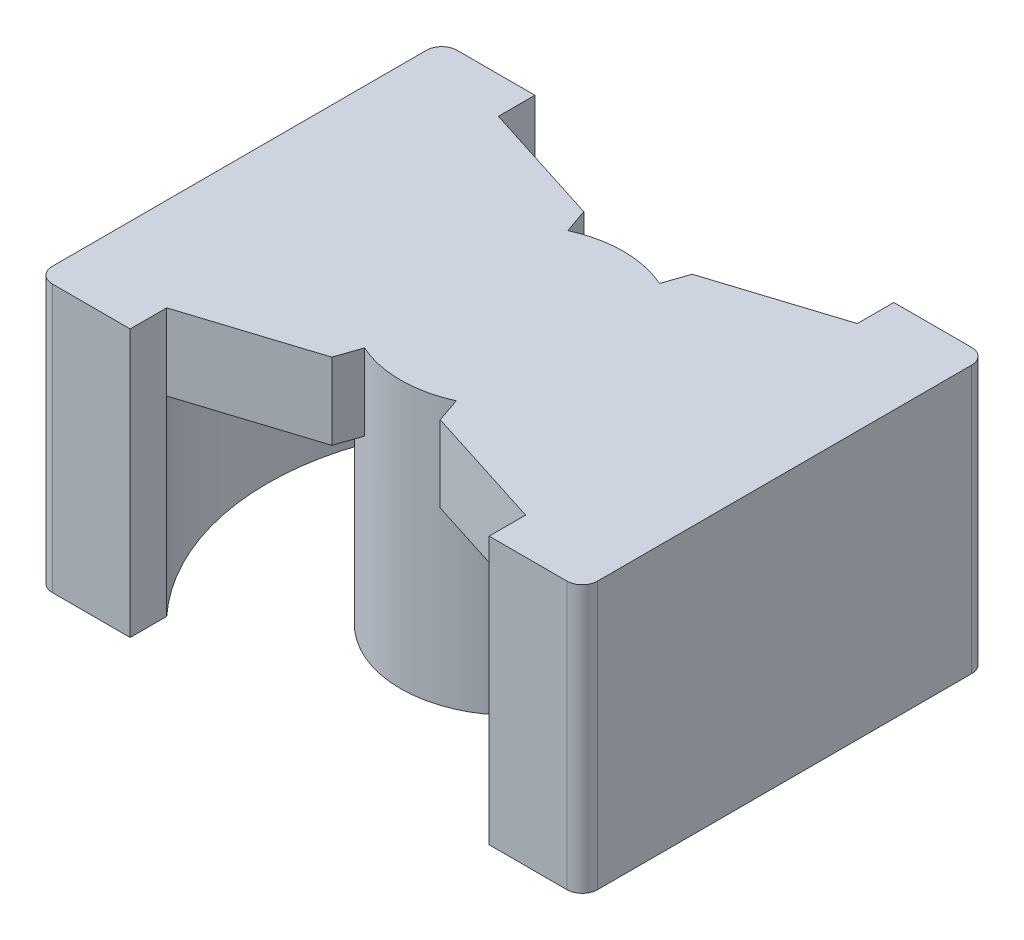
ISO-10303-21;
HEADER;
FILE_DESCRIPTION(('STEP AP214'),'2;1');
FILE_NAME('part.step','',(''),(''),'','','');
FILE_SCHEMA(('AUTOMOTIVE_DESIGN { 1 0 10303 214 1 1 1 1 }'));
ENDSEC;
DATA;
#1=APPLICATION_CONTEXT('core data for automotive mechanical design processes');
#2=APPLICATION_PROTOCOL_DEFINITION('international standard','automotive_design',2000,#1);
#3=PRODUCT_CONTEXT('',#1,'mechanical');
#4=PRODUCT('Part','Part','',(#3));
#5=PRODUCT_RELATED_PRODUCT_CATEGORY('part','',(#4));
#6=PRODUCT_DEFINITION_FORMATION('','',#4);
#7=PRODUCT_DEFINITION_CONTEXT('part definition',#1,'design');
#8=PRODUCT_DEFINITION('design','',#6,#7);
#9=PRODUCT_DEFINITION_SHAPE('','',#8);
#10=(LENGTH_UNIT() NAMED_UNIT(*) SI_UNIT(.MILLI.,.METRE.));
#11=(NAMED_UNIT(*) PLANE_ANGLE_UNIT() SI_UNIT($,.RADIAN.));
#12=(NAMED_UNIT(*) SI_UNIT($,.STERADIAN.) SOLID_ANGLE_UNIT());
#13=UNCERTAINTY_MEASURE_WITH_UNIT(LENGTH_MEASURE(1.E-05),#10,'distance_accuracy_value','');
#14=(GEOMETRIC_REPRESENTATION_CONTEXT(3) GLOBAL_UNCERTAINTY_ASSIGNED_CONTEXT((#13)) GLOBAL_UNIT_ASSIGNED_CONTEXT((#10,
#11,#12)) REPRESENTATION_CONTEXT('',''));
#15=CARTESIAN_POINT('',(0.,0.,0.));
#16=DIRECTION('',(0.,0.,1.));
#17=DIRECTION('',(1.,0.,0.));
#18=AXIS2_PLACEMENT_3D('',#15,#16,#17);
#19=CARTESIAN_POINT('',(16.85,17.5,12.25));
#20=DIRECTION('',(0.,-1.,0.));
#21=DIRECTION('',(0.,0.,-1.));
#22=AXIS2_PLACEMENT_3D('',#19,#20,#21);
#23=CYLINDRICAL_SURFACE('',#22,1.);
#24=CARTESIAN_POINT('',(16.85,0.,12.25));
#25=DIRECTION('',(0.,-1.,0.));
#26=DIRECTION('',(0.,0.,-1.));
#27=AXIS2_PLACEMENT_3D('',#24,#25,#26);
#28=CIRCLE('',#27,1.);
#29=CARTESIAN_POINT('',(17.85,0.,12.25));
#30=VERTEX_POINT('',#29);
#31=CARTESIAN_POINT('',(16.85,0.,13.25));
#32=VERTEX_POINT('',#31);
#33=EDGE_CURVE('E466',#30,#32,#28,.T.);
#34=ORIENTED_EDGE('',*,*,#33,.F.);
#35=DIRECTION('',(0.,1.,0.));
#36=VECTOR('',#35,1.);
#37=CARTESIAN_POINT('',(17.85,17.5,12.25));
#38=LINE('',#37,#36);
#39=CARTESIAN_POINT('',(17.85,17.5,12.25));
#40=VERTEX_POINT('',#39);
#41=EDGE_CURVE('E192',#30,#40,#38,.T.);
#42=ORIENTED_EDGE('',*,*,#41,.T.);
#43=CARTESIAN_POINT('',(16.85,17.5,12.25));
#44=DIRECTION('',(0.,-1.,0.));
#45=DIRECTION('',(0.,0.,-1.));
#46=AXIS2_PLACEMENT_3D('',#43,#44,#45);
#47=CIRCLE('',#46,1.);
#48=CARTESIAN_POINT('',(16.85,17.5,13.25));
#49=VERTEX_POINT('',#48);
#50=EDGE_CURVE('E20',#40,#49,#47,.T.);
#51=ORIENTED_EDGE('',*,*,#50,.T.);
#52=DIRECTION('',(0.,1.,0.));
#53=VECTOR('',#52,1.);
#54=CARTESIAN_POINT('',(16.85,17.5,13.25));
#55=LINE('',#54,#53);
#56=EDGE_CURVE('E190',#49,#32,#55,.F.);
#57=ORIENTED_EDGE('',*,*,#56,.T.);
#58=EDGE_LOOP('',(#34,#42,#51,#57));
#59=FACE_BOUND('',#58,.T.);
#60=ADVANCED_FACE('F17',(#59),#23,.T.);
#61=CARTESIAN_POINT('',(-16.85,17.5,12.25));
#62=DIRECTION('',(0.,-1.,0.));
#63=DIRECTION('',(0.,0.,-1.));
#64=AXIS2_PLACEMENT_3D('',#61,#62,#63);
#65=CYLINDRICAL_SURFACE('',#64,1.);
#66=CARTESIAN_POINT('',(-16.85,0.,12.25));
#67=DIRECTION('',(0.,-1.,0.));
#68=DIRECTION('',(0.,0.,-1.));
#69=AXIS2_PLACEMENT_3D('',#66,#67,#68);
#70=CIRCLE('',#69,1.);
#71=CARTESIAN_POINT('',(-16.85,0.,13.25));
#72=VERTEX_POINT('',#71);
#73=CARTESIAN_POINT('',(-17.85,0.,12.25));
#74=VERTEX_POINT('',#73);
#75=EDGE_CURVE('E475',#72,#74,#70,.T.);
#76=ORIENTED_EDGE('',*,*,#75,.F.);
#77=DIRECTION('',(0.,1.,0.));
#78=VECTOR('',#77,1.);
#79=CARTESIAN_POINT('',(-16.85,17.5,13.25));
#80=LINE('',#79,#78);
#81=CARTESIAN_POINT('',(-16.85,17.5,13.25));
#82=VERTEX_POINT('',#81);
#83=EDGE_CURVE('E286',#72,#82,#80,.T.);
#84=ORIENTED_EDGE('',*,*,#83,.T.);
#85=CARTESIAN_POINT('',(-16.85,17.5,12.25));
#86=DIRECTION('',(0.,-1.,0.));
#87=DIRECTION('',(0.,0.,-1.));
#88=AXIS2_PLACEMENT_3D('',#85,#86,#87);
#89=CIRCLE('',#88,1.);
#90=CARTESIAN_POINT('',(-17.85,17.5,12.25));
#91=VERTEX_POINT('',#90);
#92=EDGE_CURVE('E194',#82,#91,#89,.T.);
#93=ORIENTED_EDGE('',*,*,#92,.T.);
#94=DIRECTION('',(0.,1.,0.));
#95=VECTOR('',#94,1.);
#96=CARTESIAN_POINT('',(-17.85,17.5,12.25));
#97=LINE('',#96,#95);
#98=EDGE_CURVE('E279',#91,#74,#97,.F.);
#99=ORIENTED_EDGE('',*,*,#98,.T.);
#100=EDGE_LOOP('',(#76,#84,#93,#99));
#101=FACE_BOUND('',#100,.T.);
#102=ADVANCED_FACE('F482',(#101),#65,.T.);
#103=CARTESIAN_POINT('',(-16.85,17.5,-12.25));
#104=DIRECTION('',(0.,-1.,0.));
#105=DIRECTION('',(0.,0.,-1.));
#106=AXIS2_PLACEMENT_3D('',#103,#104,#105);
#107=CYLINDRICAL_SURFACE('',#106,1.);
#108=CARTESIAN_POINT('',(-16.85,0.,-12.25));
#109=DIRECTION('',(0.,-1.,0.));
#110=DIRECTION('',(0.,0.,-1.));
#111=AXIS2_PLACEMENT_3D('',#108,#109,#110);
#112=CIRCLE('',#111,1.);
#113=CARTESIAN_POINT('',(-17.85,0.,-12.25));
#114=VERTEX_POINT('',#113);
#115=CARTESIAN_POINT('',(-16.85,0.,-13.25));
#116=VERTEX_POINT('',#115);
#117=EDGE_CURVE('E387',#114,#116,#112,.T.);
#118=ORIENTED_EDGE('',*,*,#117,.F.);
#119=DIRECTION('',(0.,1.,0.));
#120=VECTOR('',#119,1.);
#121=CARTESIAN_POINT('',(-17.85,17.5,-12.25));
#122=LINE('',#121,#120);
#123=CARTESIAN_POINT('',(-17.85,17.5,-12.25));
#124=VERTEX_POINT('',#123);
#125=EDGE_CURVE('E282',#114,#124,#122,.T.);
#126=ORIENTED_EDGE('',*,*,#125,.T.);
#127=CARTESIAN_POINT('',(-16.85,17.5,-12.25));
#128=DIRECTION('',(0.,-1.,0.));
#129=DIRECTION('',(0.,0.,-1.));
#130=AXIS2_PLACEMENT_3D('',#127,#128,#129);
#131=CIRCLE('',#130,1.);
#132=CARTESIAN_POINT('',(-16.85,17.5,-13.25));
#133=VERTEX_POINT('',#132);
#134=EDGE_CURVE('E479',#124,#133,#131,.T.);
#135=ORIENTED_EDGE('',*,*,#134,.T.);
#136=DIRECTION('',(0.,1.,0.));
#137=VECTOR('',#136,1.);
#138=CARTESIAN_POINT('',(-16.85,17.5,-13.25));
#139=LINE('',#138,#137);
#140=EDGE_CURVE('E260',#133,#116,#139,.F.);
#141=ORIENTED_EDGE('',*,*,#140,.T.);
#142=EDGE_LOOP('',(#118,#126,#135,#141));
#143=FACE_BOUND('',#142,.T.);
#144=ADVANCED_FACE('F628',(#143),#107,.T.);
#145=CARTESIAN_POINT('',(0.,12.5,0.));
#146=DIRECTION('',(0.,-1.,0.));
#147=DIRECTION('',(0.,0.,-1.));
#148=AXIS2_PLACEMENT_3D('',#145,#146,#147);
#149=CYLINDRICAL_SURFACE('',#148,16.);
#150=CARTESIAN_POINT('',(0.,12.5,0.));
#151=DIRECTION('',(0.,-1.,0.));
#152=DIRECTION('',(0.,0.,-1.));
#153=AXIS2_PLACEMENT_3D('',#150,#151,#152);
#154=CIRCLE('',#153,16.);
#155=CARTESIAN_POINT('',(-11.75,12.5,-10.8599033144867));
#156=VERTEX_POINT('',#155);
#157=CARTESIAN_POINT('',(-11.75,12.5,10.8599033144867));
#158=VERTEX_POINT('',#157);
#159=EDGE_CURVE('E377',#156,#158,#154,.F.);
#160=ORIENTED_EDGE('',*,*,#159,.T.);
#161=DIRECTION('',(0.,1.,0.));
#162=VECTOR('',#161,1.);
#163=CARTESIAN_POINT('',(-11.75,17.5,10.8599033144867));
#164=LINE('',#163,#162);
#165=CARTESIAN_POINT('',(-11.75,0.,10.8599033144867));
#166=VERTEX_POINT('',#165);
#167=EDGE_CURVE('E303',#166,#158,#164,.T.);
#168=ORIENTED_EDGE('',*,*,#167,.F.);
#169=CARTESIAN_POINT('',(0.,0.,0.));
#170=DIRECTION('',(0.,-1.,0.));
#171=DIRECTION('',(0.,0.,-1.));
#172=AXIS2_PLACEMENT_3D('',#169,#170,#171);
#173=CIRCLE('',#172,16.);
#174=CARTESIAN_POINT('',(-11.75,0.,-10.8599033144867));
#175=VERTEX_POINT('',#174);
#176=EDGE_CURVE('E477',#175,#166,#173,.F.);
#177=ORIENTED_EDGE('',*,*,#176,.F.);
#178=DIRECTION('',(0.,1.,0.));
#179=VECTOR('',#178,1.);
#180=CARTESIAN_POINT('',(-11.75,17.5,-10.8599033144867));
#181=LINE('',#180,#179);
#182=EDGE_CURVE('E276',#175,#156,#181,.T.);
#183=ORIENTED_EDGE('',*,*,#182,.T.);
#184=EDGE_LOOP('',(#160,#168,#177,#183));
#185=FACE_BOUND('',#184,.T.);
#186=ADVANCED_FACE('F624',(#185),#149,.F.);
#187=CARTESIAN_POINT('',(17.85,0.,-13.25));
#188=DIRECTION('',(0.,-1.,0.));
#189=DIRECTION('',(0.,0.,-1.));
#190=AXIS2_PLACEMENT_3D('',#187,#188,#189);
#191=PLANE('',#190);
#192=ORIENTED_EDGE('',*,*,#117,.T.);
#193=DIRECTION('',(1.,0.,0.));
#194=VECTOR('',#193,1.);
#195=CARTESIAN_POINT('',(-17.85,0.,-13.25));
#196=LINE('',#195,#194);
#197=CARTESIAN_POINT('',(-11.75,0.,-13.25));
#198=VERTEX_POINT('',#197);
#199=EDGE_CURVE('E263',#116,#198,#196,.T.);
#200=ORIENTED_EDGE('',*,*,#199,.T.);
#201=DIRECTION('',(0.,0.,1.));
#202=VECTOR('',#201,1.);
#203=CARTESIAN_POINT('',(-11.75,0.,-13.25));
#204=LINE('',#203,#202);
#205=EDGE_CURVE('E275',#198,#175,#204,.T.);
#206=ORIENTED_EDGE('',*,*,#205,.T.);
#207=ORIENTED_EDGE('',*,*,#176,.T.);
#208=DIRECTION('',(0.,0.,-1.));
#209=VECTOR('',#208,1.);
#210=CARTESIAN_POINT('',(-11.75,0.,13.25));
#211=LINE('',#210,#209);
#212=CARTESIAN_POINT('',(-11.75,0.,13.25));
#213=VERTEX_POINT('',#212);
#214=EDGE_CURVE('E314',#213,#166,#211,.T.);
#215=ORIENTED_EDGE('',*,*,#214,.F.);
#216=DIRECTION('',(-1.,0.,0.));
#217=VECTOR('',#216,1.);
#218=CARTESIAN_POINT('',(-17.85,0.,13.25));
#219=LINE('',#218,#217);
#220=EDGE_CURVE('E289',#213,#72,#219,.T.);
#221=ORIENTED_EDGE('',*,*,#220,.T.);
#222=ORIENTED_EDGE('',*,*,#75,.T.);
#223=DIRECTION('',(0.,0.,-1.));
#224=VECTOR('',#223,1.);
#225=CARTESIAN_POINT('',(-17.85,0.,13.25));
#226=LINE('',#225,#224);
#227=EDGE_CURVE('E264',#74,#114,#226,.T.);
#228=ORIENTED_EDGE('',*,*,#227,.T.);
#229=EDGE_LOOP('',(#192,#200,#206,#207,#215,#221,#222,#228));
#230=FACE_BOUND('',#229,.T.);
#231=ADVANCED_FACE('F621',(#230),#191,.T.);
#232=CARTESIAN_POINT('',(-3.55,17.5,8.25));
#233=DIRECTION('',(0.945368367347967,0.,0.326004064419203));
#234=DIRECTION('',(0.326004064419203,0.,-0.945368367347967));
#235=AXIS2_PLACEMENT_3D('',#232,#233,#234);
#236=PLANE('',#235);
#237=DIRECTION('',(0.326004064419203,0.,-0.945368367347967));
#238=VECTOR('',#237,1.);
#239=CARTESIAN_POINT('',(-3.55,17.5,8.25));
#240=LINE('',#239,#238);
#241=CARTESIAN_POINT('',(-3.,17.5,6.65507325278993));
#242=VERTEX_POINT('',#241);
#243=CARTESIAN_POINT('',(-3.55,17.5,8.25));
#244=VERTEX_POINT('',#243);
#245=EDGE_CURVE('E383',#242,#244,#240,.F.);
#246=ORIENTED_EDGE('',*,*,#245,.T.);
#247=DIRECTION('',(0.,1.,0.));
#248=VECTOR('',#247,1.);
#249=CARTESIAN_POINT('',(-3.55,17.5,8.25));
#250=LINE('',#249,#248);
#251=CARTESIAN_POINT('',(-3.55,12.5,8.25));
#252=VERTEX_POINT('',#251);
#253=EDGE_CURVE('E311',#252,#244,#250,.T.);
#254=ORIENTED_EDGE('',*,*,#253,.F.);
#255=DIRECTION('',(0.326004064419203,0.,-0.945368367347967));
#256=VECTOR('',#255,1.);
#257=CARTESIAN_POINT('',(-3.55,12.5,8.25));
#258=LINE('',#257,#256);
#259=CARTESIAN_POINT('',(-3.,12.5,6.65507325278993));
#260=VERTEX_POINT('',#259);
#261=EDGE_CURVE('E380',#252,#260,#258,.T.);
#262=ORIENTED_EDGE('',*,*,#261,.T.);
#263=DIRECTION('',(0.,-1.,0.));
#264=VECTOR('',#263,1.);
#265=CARTESIAN_POINT('',(-3.,12.5,6.65507325278993));
#266=LINE('',#265,#264);
#267=EDGE_CURVE('E318',#242,#260,#266,.T.);
#268=ORIENTED_EDGE('',*,*,#267,.F.);
#269=EDGE_LOOP('',(#246,#254,#262,#268));
#270=FACE_BOUND('',#269,.T.);
#271=ADVANCED_FACE('F516',(#270),#236,.T.);
#272=CARTESIAN_POINT('',(0.,12.5,0.));
#273=DIRECTION('',(0.,1.,0.));
#274=DIRECTION('',(0.,0.,1.));
#275=AXIS2_PLACEMENT_3D('',#272,#273,#274);
#276=PLANE('',#275);
#277=DIRECTION('',(0.95289849900019,0.,0.303289384257321));
#278=VECTOR('',#277,1.);
#279=CARTESIAN_POINT('',(-11.75,12.5,-10.8599033144867));
#280=LINE('',#279,#278);
#281=CARTESIAN_POINT('',(-3.55,12.5,-8.25));
#282=VERTEX_POINT('',#281);
#283=EDGE_CURVE('E392',#156,#282,#280,.T.);
#284=ORIENTED_EDGE('',*,*,#283,.T.);
#285=DIRECTION('',(0.326004064419203,0.,0.945368367347967));
#286=VECTOR('',#285,1.);
#287=CARTESIAN_POINT('',(-3.55,12.5,-8.25));
#288=LINE('',#287,#286);
#289=CARTESIAN_POINT('',(-3.,12.5,-6.65507325278993));
#290=VERTEX_POINT('',#289);
#291=EDGE_CURVE('E372',#282,#290,#288,.T.);
#292=ORIENTED_EDGE('',*,*,#291,.T.);
#293=CARTESIAN_POINT('',(0.,12.5,0.));
#294=DIRECTION('',(0.,-1.,0.));
#295=DIRECTION('',(0.,0.,-1.));
#296=AXIS2_PLACEMENT_3D('',#293,#294,#295);
#297=CIRCLE('',#296,7.3);
#298=EDGE_CURVE('E259',#260,#290,#297,.T.);
#299=ORIENTED_EDGE('',*,*,#298,.F.);
#300=ORIENTED_EDGE('',*,*,#261,.F.);
#301=DIRECTION('',(0.95289849900019,0.,-0.303289384257321));
#302=VECTOR('',#301,1.);
#303=CARTESIAN_POINT('',(-11.75,12.5,10.8599033144867));
#304=LINE('',#303,#302);
#305=EDGE_CURVE('E315',#158,#252,#304,.T.);
#306=ORIENTED_EDGE('',*,*,#305,.F.);
#307=ORIENTED_EDGE('',*,*,#159,.F.);
#308=EDGE_LOOP('',(#284,#292,#299,#300,#306,#307));
#309=FACE_BOUND('',#308,.T.);
#310=ADVANCED_FACE('F614',(#309),#276,.F.);
#311=CARTESIAN_POINT('',(-3.55,17.5,-8.25));
#312=DIRECTION('',(-0.945368367347967,0.,0.326004064419203));
#313=DIRECTION('',(0.326004064419203,0.,0.945368367347967));
#314=AXIS2_PLACEMENT_3D('',#311,#312,#313);
#315=PLANE('',#314);
#316=DIRECTION('',(0.326004064419203,0.,0.945368367347967));
#317=VECTOR('',#316,1.);
#318=CARTESIAN_POINT('',(-3.55,17.5,-8.25));
#319=LINE('',#318,#317);
#320=CARTESIAN_POINT('',(-3.,17.5,-6.65507325278993));
#321=VERTEX_POINT('',#320);
#322=CARTESIAN_POINT('',(-3.55,17.5,-8.25));
#323=VERTEX_POINT('',#322);
#324=EDGE_CURVE('E368',#321,#323,#319,.F.);
#325=ORIENTED_EDGE('',*,*,#324,.F.);
#326=DIRECTION('',(0.,-1.,0.));
#327=VECTOR('',#326,1.);
#328=CARTESIAN_POINT('',(-3.,12.5,-6.65507325278993));
#329=LINE('',#328,#327);
#330=EDGE_CURVE('E256',#290,#321,#329,.F.);
#331=ORIENTED_EDGE('',*,*,#330,.F.);
#332=ORIENTED_EDGE('',*,*,#291,.F.);
#333=DIRECTION('',(0.,1.,0.));
#334=VECTOR('',#333,1.);
#335=CARTESIAN_POINT('',(-3.55,17.5,-8.25));
#336=LINE('',#335,#334);
#337=EDGE_CURVE('E395',#282,#323,#336,.T.);
#338=ORIENTED_EDGE('',*,*,#337,.T.);
#339=EDGE_LOOP('',(#325,#331,#332,#338));
#340=FACE_BOUND('',#339,.T.);
#341=ADVANCED_FACE('F610',(#340),#315,.F.);
#342=CARTESIAN_POINT('',(17.85,0.,-13.25));
#343=DIRECTION('',(0.,-1.,0.));
#344=DIRECTION('',(0.,0.,-1.));
#345=AXIS2_PLACEMENT_3D('',#342,#343,#344);
#346=PLANE('',#345);
#347=CARTESIAN_POINT('',(0.,0.,0.));
#348=DIRECTION('',(0.,-1.,0.));
#349=DIRECTION('',(0.,0.,-1.));
#350=AXIS2_PLACEMENT_3D('',#347,#348,#349);
#351=CIRCLE('',#350,7.3);
#352=CARTESIAN_POINT('',(0.,0.,-7.3));
#353=VERTEX_POINT('',#352);
#354=EDGE_CURVE('E255',#353,#353,#351,.F.);
#355=ORIENTED_EDGE('',*,*,#354,.F.);
#356=EDGE_LOOP('',(#355));
#357=FACE_BOUND('',#356,.T.);
#358=ADVANCED_FACE('F607',(#357),#346,.T.);
#359=CARTESIAN_POINT('',(3.55,17.5,8.25));
#360=DIRECTION('',(-0.945368367347967,0.,0.326004064419203));
#361=DIRECTION('',(0.326004064419203,0.,0.945368367347967));
#362=AXIS2_PLACEMENT_3D('',#359,#360,#361);
#363=PLANE('',#362);
#364=DIRECTION('',(0.326004064419203,0.,0.945368367347967));
#365=VECTOR('',#364,1.);
#366=CARTESIAN_POINT('',(3.55,17.5,8.25));
#367=LINE('',#366,#365);
#368=CARTESIAN_POINT('',(3.55,17.5,8.25));
#369=VERTEX_POINT('',#368);
#370=CARTESIAN_POINT('',(3.,17.5,6.65507325278993));
#371=VERTEX_POINT('',#370);
#372=EDGE_CURVE('E364',#369,#371,#367,.F.);
#373=ORIENTED_EDGE('',*,*,#372,.T.);
#374=DIRECTION('',(0.,-1.,0.));
#375=VECTOR('',#374,1.);
#376=CARTESIAN_POINT('',(3.,12.5,6.65507325278993));
#377=LINE('',#376,#375);
#378=CARTESIAN_POINT('',(3.,12.5,6.65507325278993));
#379=VERTEX_POINT('',#378);
#380=EDGE_CURVE('E321',#379,#371,#377,.F.);
#381=ORIENTED_EDGE('',*,*,#380,.F.);
#382=DIRECTION('',(0.326004064419204,0.,0.945368367347966));
#383=VECTOR('',#382,1.);
#384=CARTESIAN_POINT('',(3.,12.5,6.65507325278993));
#385=LINE('',#384,#383);
#386=CARTESIAN_POINT('',(3.55,12.5,8.25));
#387=VERTEX_POINT('',#386);
#388=EDGE_CURVE('E360',#379,#387,#385,.T.);
#389=ORIENTED_EDGE('',*,*,#388,.T.);
#390=DIRECTION('',(0.,1.,0.));
#391=VECTOR('',#390,1.);
#392=CARTESIAN_POINT('',(3.55,17.5,8.25));
#393=LINE('',#392,#391);
#394=EDGE_CURVE('E423',#369,#387,#393,.F.);
#395=ORIENTED_EDGE('',*,*,#394,.F.);
#396=EDGE_LOOP('',(#373,#381,#389,#395));
#397=FACE_BOUND('',#396,.T.);
#398=ADVANCED_FACE('F523',(#397),#363,.T.);
#399=CARTESIAN_POINT('',(0.,12.5,0.));
#400=DIRECTION('',(0.,1.,0.));
#401=DIRECTION('',(0.,0.,1.));
#402=AXIS2_PLACEMENT_3D('',#399,#400,#401);
#403=PLANE('',#402);
#404=DIRECTION('',(0.326004064419203,0.,-0.945368367347967));
#405=VECTOR('',#404,1.);
#406=CARTESIAN_POINT('',(3.55,12.5,-8.25));
#407=LINE('',#406,#405);
#408=CARTESIAN_POINT('',(3.,12.5,-6.65507325278993));
#409=VERTEX_POINT('',#408);
#410=CARTESIAN_POINT('',(3.55,12.5,-8.25));
#411=VERTEX_POINT('',#410);
#412=EDGE_CURVE('E355',#409,#411,#407,.T.);
#413=ORIENTED_EDGE('',*,*,#412,.T.);
#414=DIRECTION('',(0.95289849900019,0.,-0.303289384257321));
#415=VECTOR('',#414,1.);
#416=CARTESIAN_POINT('',(11.75,12.5,-10.8599033144867));
#417=LINE('',#416,#415);
#418=CARTESIAN_POINT('',(11.75,12.5,-10.8599033144867));
#419=VERTEX_POINT('',#418);
#420=EDGE_CURVE('E248',#411,#419,#417,.T.);
#421=ORIENTED_EDGE('',*,*,#420,.T.);
#422=CARTESIAN_POINT('',(0.,12.5,0.));
#423=DIRECTION('',(0.,-1.,0.));
#424=DIRECTION('',(0.,0.,-1.));
#425=AXIS2_PLACEMENT_3D('',#422,#423,#424);
#426=CIRCLE('',#425,16.);
#427=CARTESIAN_POINT('',(11.75,12.5,10.8599033144867));
#428=VERTEX_POINT('',#427);
#429=EDGE_CURVE('E354',#419,#428,#426,.T.);
#430=ORIENTED_EDGE('',*,*,#429,.T.);
#431=DIRECTION('',(0.95289849900019,0.,0.303289384257321));
#432=VECTOR('',#431,1.);
#433=CARTESIAN_POINT('',(11.75,12.5,10.8599033144867));
#434=LINE('',#433,#432);
#435=EDGE_CURVE('E430',#387,#428,#434,.T.);
#436=ORIENTED_EDGE('',*,*,#435,.F.);
#437=ORIENTED_EDGE('',*,*,#388,.F.);
#438=CARTESIAN_POINT('',(0.,12.5,0.));
#439=DIRECTION('',(0.,-1.,0.));
#440=DIRECTION('',(0.,0.,-1.));
#441=AXIS2_PLACEMENT_3D('',#438,#439,#440);
#442=CIRCLE('',#441,7.3);
#443=EDGE_CURVE('E254',#409,#379,#442,.T.);
#444=ORIENTED_EDGE('',*,*,#443,.F.);
#445=EDGE_LOOP('',(#413,#421,#430,#436,#437,#444));
#446=FACE_BOUND('',#445,.T.);
#447=ADVANCED_FACE('F600',(#446),#403,.F.);
#448=CARTESIAN_POINT('',(3.55,17.5,-8.25));
#449=DIRECTION('',(0.945368367347967,0.,0.326004064419203));
#450=DIRECTION('',(0.326004064419203,0.,-0.945368367347967));
#451=AXIS2_PLACEMENT_3D('',#448,#449,#450);
#452=PLANE('',#451);
#453=DIRECTION('',(0.326004064419203,0.,-0.945368367347967));
#454=VECTOR('',#453,1.);
#455=CARTESIAN_POINT('',(3.55,17.5,-8.25));
#456=LINE('',#455,#454);
#457=CARTESIAN_POINT('',(3.55,17.5,-8.25));
#458=VERTEX_POINT('',#457);
#459=CARTESIAN_POINT('',(3.,17.5,-6.65507325278993));
#460=VERTEX_POINT('',#459);
#461=EDGE_CURVE('E351',#458,#460,#456,.F.);
#462=ORIENTED_EDGE('',*,*,#461,.F.);
#463=DIRECTION('',(0.,1.,0.));
#464=VECTOR('',#463,1.);
#465=CARTESIAN_POINT('',(3.55,17.5,-8.25));
#466=LINE('',#465,#464);
#467=EDGE_CURVE('E238',#458,#411,#466,.F.);
#468=ORIENTED_EDGE('',*,*,#467,.T.);
#469=ORIENTED_EDGE('',*,*,#412,.F.);
#470=DIRECTION('',(0.,-1.,0.));
#471=VECTOR('',#470,1.);
#472=CARTESIAN_POINT('',(3.,12.5,-6.65507325278993));
#473=LINE('',#472,#471);
#474=EDGE_CURVE('E251',#460,#409,#473,.T.);
#475=ORIENTED_EDGE('',*,*,#474,.F.);
#476=EDGE_LOOP('',(#462,#468,#469,#475));
#477=FACE_BOUND('',#476,.T.);
#478=ADVANCED_FACE('F596',(#477),#452,.F.);
#479=CARTESIAN_POINT('',(0.,12.5,0.));
#480=DIRECTION('',(0.,-1.,0.));
#481=DIRECTION('',(0.,0.,-1.));
#482=AXIS2_PLACEMENT_3D('',#479,#480,#481);
#483=CYLINDRICAL_SURFACE('',#482,16.);
#484=CARTESIAN_POINT('',(0.,0.,0.));
#485=DIRECTION('',(0.,-1.,0.));
#486=DIRECTION('',(0.,0.,-1.));
#487=AXIS2_PLACEMENT_3D('',#484,#485,#486);
#488=CIRCLE('',#487,16.);
#489=CARTESIAN_POINT('',(11.75,0.,10.8599033144867));
#490=VERTEX_POINT('',#489);
#491=CARTESIAN_POINT('',(11.75,0.,-10.8599033144867));
#492=VERTEX_POINT('',#491);
#493=EDGE_CURVE('E336',#490,#492,#488,.F.);
#494=ORIENTED_EDGE('',*,*,#493,.F.);
#495=DIRECTION('',(0.,1.,0.));
#496=VECTOR('',#495,1.);
#497=CARTESIAN_POINT('',(11.75,17.5,10.8599033144867));
#498=LINE('',#497,#496);
#499=EDGE_CURVE('E328',#428,#490,#498,.F.);
#500=ORIENTED_EDGE('',*,*,#499,.F.);
#501=ORIENTED_EDGE('',*,*,#429,.F.);
#502=DIRECTION('',(0.,1.,0.));
#503=VECTOR('',#502,1.);
#504=CARTESIAN_POINT('',(11.75,17.5,-10.8599033144867));
#505=LINE('',#504,#503);
#506=EDGE_CURVE('E237',#419,#492,#505,.F.);
#507=ORIENTED_EDGE('',*,*,#506,.T.);
#508=EDGE_LOOP('',(#494,#500,#501,#507));
#509=FACE_BOUND('',#508,.T.);
#510=ADVANCED_FACE('F593',(#509),#483,.F.);
#511=CARTESIAN_POINT('',(16.85,17.5,-12.25));
#512=DIRECTION('',(0.,-1.,0.));
#513=DIRECTION('',(0.,0.,-1.));
#514=AXIS2_PLACEMENT_3D('',#511,#512,#513);
#515=CYLINDRICAL_SURFACE('',#514,1.);
#516=CARTESIAN_POINT('',(16.85,0.,-12.25));
#517=DIRECTION('',(0.,-1.,0.));
#518=DIRECTION('',(0.,0.,-1.));
#519=AXIS2_PLACEMENT_3D('',#516,#517,#518);
#520=CIRCLE('',#519,1.);
#521=CARTESIAN_POINT('',(16.85,0.,-13.25));
#522=VERTEX_POINT('',#521);
#523=CARTESIAN_POINT('',(17.85,0.,-12.25));
#524=VERTEX_POINT('',#523);
#525=EDGE_CURVE('E468',#522,#524,#520,.T.);
#526=ORIENTED_EDGE('',*,*,#525,.F.);
#527=DIRECTION('',(0.,1.,0.));
#528=VECTOR('',#527,1.);
#529=CARTESIAN_POINT('',(16.85,17.5,-13.25));
#530=LINE('',#529,#528);
#531=CARTESIAN_POINT('',(16.85,17.5,-13.25));
#532=VERTEX_POINT('',#531);
#533=EDGE_CURVE('E222',#522,#532,#530,.T.);
#534=ORIENTED_EDGE('',*,*,#533,.T.);
#535=CARTESIAN_POINT('',(16.85,17.5,-12.25));
#536=DIRECTION('',(0.,-1.,0.));
#537=DIRECTION('',(0.,0.,-1.));
#538=AXIS2_PLACEMENT_3D('',#535,#536,#537);
#539=CIRCLE('',#538,1.);
#540=CARTESIAN_POINT('',(17.85,17.5,-12.25));
#541=VERTEX_POINT('',#540);
#542=EDGE_CURVE('E470',#532,#541,#539,.T.);
#543=ORIENTED_EDGE('',*,*,#542,.T.);
#544=DIRECTION('',(0.,1.,0.));
#545=VECTOR('',#544,1.);
#546=CARTESIAN_POINT('',(17.85,17.5,-12.25));
#547=LINE('',#546,#545);
#548=EDGE_CURVE('E332',#541,#524,#547,.F.);
#549=ORIENTED_EDGE('',*,*,#548,.T.);
#550=EDGE_LOOP('',(#526,#534,#543,#549));
#551=FACE_BOUND('',#550,.T.);
#552=ADVANCED_FACE('F539',(#551),#515,.T.);
#553=CARTESIAN_POINT('',(17.85,0.,-13.25));
#554=DIRECTION('',(0.,-1.,0.));
#555=DIRECTION('',(0.,0.,-1.));
#556=AXIS2_PLACEMENT_3D('',#553,#554,#555);
#557=PLANE('',#556);
#558=DIRECTION('',(0.,0.,1.));
#559=VECTOR('',#558,1.);
#560=CARTESIAN_POINT('',(11.75,0.,13.25));
#561=LINE('',#560,#559);
#562=CARTESIAN_POINT('',(11.75,0.,13.25));
#563=VERTEX_POINT('',#562);
#564=EDGE_CURVE('E329',#490,#563,#561,.T.);
#565=ORIENTED_EDGE('',*,*,#564,.F.);
#566=ORIENTED_EDGE('',*,*,#493,.T.);
#567=DIRECTION('',(0.,0.,-1.));
#568=VECTOR('',#567,1.);
#569=CARTESIAN_POINT('',(11.75,0.,-13.25));
#570=LINE('',#569,#568);
#571=CARTESIAN_POINT('',(11.75,0.,-13.25));
#572=VERTEX_POINT('',#571);
#573=EDGE_CURVE('E225',#492,#572,#570,.T.);
#574=ORIENTED_EDGE('',*,*,#573,.T.);
#575=DIRECTION('',(1.,0.,0.));
#576=VECTOR('',#575,1.);
#577=CARTESIAN_POINT('',(-17.85,0.,-13.25));
#578=LINE('',#577,#576);
#579=EDGE_CURVE('E214',#572,#522,#578,.T.);
#580=ORIENTED_EDGE('',*,*,#579,.T.);
#581=ORIENTED_EDGE('',*,*,#525,.T.);
#582=DIRECTION('',(0.,0.,1.));
#583=VECTOR('',#582,1.);
#584=CARTESIAN_POINT('',(17.85,0.,13.25));
#585=LINE('',#584,#583);
#586=EDGE_CURVE('E335',#524,#30,#585,.T.);
#587=ORIENTED_EDGE('',*,*,#586,.T.);
#588=ORIENTED_EDGE('',*,*,#33,.T.);
#589=DIRECTION('',(-1.,0.,0.));
#590=VECTOR('',#589,1.);
#591=CARTESIAN_POINT('',(-17.85,0.,13.25));
#592=LINE('',#591,#590);
#593=EDGE_CURVE('E202',#32,#563,#592,.T.);
#594=ORIENTED_EDGE('',*,*,#593,.T.);
#595=EDGE_LOOP('',(#565,#566,#574,#580,#581,#587,#588,#594));
#596=FACE_BOUND('',#595,.T.);
#597=ADVANCED_FACE('F532',(#596),#557,.T.);
#598=CARTESIAN_POINT('',(17.85,17.5,13.25));
#599=DIRECTION('',(-1.,0.,0.));
#600=DIRECTION('',(0.,0.,1.));
#601=AXIS2_PLACEMENT_3D('',#598,#599,#600);
#602=PLANE('',#601);
#603=ORIENTED_EDGE('',*,*,#41,.F.);
#604=ORIENTED_EDGE('',*,*,#586,.F.);
#605=ORIENTED_EDGE('',*,*,#548,.F.);
#606=DIRECTION('',(0.,0.,-1.));
#607=VECTOR('',#606,1.);
#608=CARTESIAN_POINT('',(17.85,17.5,-13.25));
#609=LINE('',#608,#607);
#610=EDGE_CURVE('E210',#541,#40,#609,.F.);
#611=ORIENTED_EDGE('',*,*,#610,.T.);
#612=EDGE_LOOP('',(#603,#604,#605,#611));
#613=FACE_BOUND('',#612,.T.);
#614=ADVANCED_FACE('F535',(#613),#602,.F.);
#615=CARTESIAN_POINT('',(-17.85,17.5,13.25));
#616=DIRECTION('',(0.,0.,-1.));
#617=DIRECTION('',(-1.,0.,0.));
#618=AXIS2_PLACEMENT_3D('',#615,#616,#617);
#619=PLANE('',#618);
#620=ORIENTED_EDGE('',*,*,#593,.F.);
#621=ORIENTED_EDGE('',*,*,#56,.F.);
#622=DIRECTION('',(1.,0.,0.));
#623=VECTOR('',#622,1.);
#624=CARTESIAN_POINT('',(17.85,17.5,13.25));
#625=LINE('',#624,#623);
#626=CARTESIAN_POINT('',(11.75,17.5,13.25));
#627=VERTEX_POINT('',#626);
#628=EDGE_CURVE('E200',#49,#627,#625,.F.);
#629=ORIENTED_EDGE('',*,*,#628,.T.);
#630=DIRECTION('',(0.,1.,0.));
#631=VECTOR('',#630,1.);
#632=CARTESIAN_POINT('',(11.75,17.5,13.25));
#633=LINE('',#632,#631);
#634=EDGE_CURVE('E326',#563,#627,#633,.T.);
#635=ORIENTED_EDGE('',*,*,#634,.F.);
#636=EDGE_LOOP('',(#620,#621,#629,#635));
#637=FACE_BOUND('',#636,.T.);
#638=ADVANCED_FACE('F198',(#637),#619,.F.);
#639=CARTESIAN_POINT('',(11.75,17.5,13.25));
#640=DIRECTION('',(-1.,0.,0.));
#641=DIRECTION('',(0.,0.,1.));
#642=AXIS2_PLACEMENT_3D('',#639,#640,#641);
#643=PLANE('',#642);
#644=DIRECTION('',(0.,1.,0.));
#645=VECTOR('',#644,1.);
#646=CARTESIAN_POINT('',(11.75,17.5,10.8599033144867));
#647=LINE('',#646,#645);
#648=CARTESIAN_POINT('',(11.75,17.5,10.8599033144867));
#649=VERTEX_POINT('',#648);
#650=EDGE_CURVE('E433',#428,#649,#647,.T.);
#651=ORIENTED_EDGE('',*,*,#650,.F.);
#652=ORIENTED_EDGE('',*,*,#499,.T.);
#653=ORIENTED_EDGE('',*,*,#564,.T.);
#654=ORIENTED_EDGE('',*,*,#634,.T.);
#655=DIRECTION('',(0.,0.,-1.));
#656=VECTOR('',#655,1.);
#657=CARTESIAN_POINT('',(11.75,17.5,-13.25));
#658=LINE('',#657,#656);
#659=EDGE_CURVE('E209',#627,#649,#658,.T.);
#660=ORIENTED_EDGE('',*,*,#659,.T.);
#661=EDGE_LOOP('',(#651,#652,#653,#654,#660));
#662=FACE_BOUND('',#661,.T.);
#663=ADVANCED_FACE('F528',(#662),#643,.T.);
#664=CARTESIAN_POINT('',(11.75,17.5,10.8599033144867));
#665=DIRECTION('',(-0.303289384257321,0.,0.95289849900019));
#666=DIRECTION('',(0.95289849900019,0.,0.303289384257321));
#667=AXIS2_PLACEMENT_3D('',#664,#665,#666);
#668=PLANE('',#667);
#669=DIRECTION('',(-0.95289849900019,0.,-0.30328938425732));
#670=VECTOR('',#669,1.);
#671=CARTESIAN_POINT('',(11.75,17.5,10.8599033144867));
#672=LINE('',#671,#670);
#673=EDGE_CURVE('E212',#649,#369,#672,.T.);
#674=ORIENTED_EDGE('',*,*,#673,.T.);
#675=ORIENTED_EDGE('',*,*,#394,.T.);
#676=ORIENTED_EDGE('',*,*,#435,.T.);
#677=ORIENTED_EDGE('',*,*,#650,.T.);
#678=EDGE_LOOP('',(#674,#675,#676,#677));
#679=FACE_BOUND('',#678,.T.);
#680=ADVANCED_FACE('F580',(#679),#668,.T.);
#681=CARTESIAN_POINT('',(-11.75,17.5,10.8599033144867));
#682=DIRECTION('',(0.303289384257321,0.,0.95289849900019));
#683=DIRECTION('',(0.95289849900019,0.,-0.303289384257321));
#684=AXIS2_PLACEMENT_3D('',#681,#682,#683);
#685=PLANE('',#684);
#686=DIRECTION('',(-0.95289849900019,0.,0.303289384257321));
#687=VECTOR('',#686,1.);
#688=CARTESIAN_POINT('',(-3.55,17.5,8.25));
#689=LINE('',#688,#687);
#690=CARTESIAN_POINT('',(-11.75,17.5,10.8599033144867));
#691=VERTEX_POINT('',#690);
#692=EDGE_CURVE('E298',#244,#691,#689,.T.);
#693=ORIENTED_EDGE('',*,*,#692,.T.);
#694=DIRECTION('',(0.,1.,0.));
#695=VECTOR('',#694,1.);
#696=CARTESIAN_POINT('',(-11.75,17.5,10.8599033144867));
#697=LINE('',#696,#695);
#698=EDGE_CURVE('E301',#158,#691,#697,.T.);
#699=ORIENTED_EDGE('',*,*,#698,.F.);
#700=ORIENTED_EDGE('',*,*,#305,.T.);
#701=ORIENTED_EDGE('',*,*,#253,.T.);
#702=EDGE_LOOP('',(#693,#699,#700,#701));
#703=FACE_BOUND('',#702,.T.);
#704=ADVANCED_FACE('F510',(#703),#685,.T.);
#705=CARTESIAN_POINT('',(-11.75,17.5,13.25));
#706=DIRECTION('',(1.,0.,0.));
#707=DIRECTION('',(0.,0.,-1.));
#708=AXIS2_PLACEMENT_3D('',#705,#706,#707);
#709=PLANE('',#708);
#710=DIRECTION('',(0.,0.,-1.));
#711=VECTOR('',#710,1.);
#712=CARTESIAN_POINT('',(-11.75,17.5,-13.25));
#713=LINE('',#712,#711);
#714=CARTESIAN_POINT('',(-11.75,17.5,13.25));
#715=VERTEX_POINT('',#714);
#716=EDGE_CURVE('E294',#691,#715,#713,.F.);
#717=ORIENTED_EDGE('',*,*,#716,.T.);
#718=DIRECTION('',(0.,1.,0.));
#719=VECTOR('',#718,1.);
#720=CARTESIAN_POINT('',(-11.75,17.5,13.25));
#721=LINE('',#720,#719);
#722=EDGE_CURVE('E285',#715,#213,#721,.F.);
#723=ORIENTED_EDGE('',*,*,#722,.T.);
#724=ORIENTED_EDGE('',*,*,#214,.T.);
#725=ORIENTED_EDGE('',*,*,#167,.T.);
#726=ORIENTED_EDGE('',*,*,#698,.T.);
#727=EDGE_LOOP('',(#717,#723,#724,#725,#726));
#728=FACE_BOUND('',#727,.T.);
#729=ADVANCED_FACE('F505',(#728),#709,.T.);
#730=CARTESIAN_POINT('',(-17.85,17.5,13.25));
#731=DIRECTION('',(0.,0.,-1.));
#732=DIRECTION('',(-1.,0.,0.));
#733=AXIS2_PLACEMENT_3D('',#730,#731,#732);
#734=PLANE('',#733);
#735=DIRECTION('',(1.,0.,0.));
#736=VECTOR('',#735,1.);
#737=CARTESIAN_POINT('',(17.85,17.5,13.25));
#738=LINE('',#737,#736);
#739=EDGE_CURVE('E297',#715,#82,#738,.F.);
#740=ORIENTED_EDGE('',*,*,#739,.T.);
#741=ORIENTED_EDGE('',*,*,#83,.F.);
#742=ORIENTED_EDGE('',*,*,#220,.F.);
#743=ORIENTED_EDGE('',*,*,#722,.F.);
#744=EDGE_LOOP('',(#740,#741,#742,#743));
#745=FACE_BOUND('',#744,.T.);
#746=ADVANCED_FACE('F501',(#745),#734,.F.);
#747=CARTESIAN_POINT('',(-17.85,17.5,13.25));
#748=DIRECTION('',(1.,0.,0.));
#749=DIRECTION('',(0.,0.,-1.));
#750=AXIS2_PLACEMENT_3D('',#747,#748,#749);
#751=PLANE('',#750);
#752=ORIENTED_EDGE('',*,*,#98,.F.);
#753=DIRECTION('',(0.,0.,-1.));
#754=VECTOR('',#753,1.);
#755=CARTESIAN_POINT('',(-17.85,17.5,-13.25));
#756=LINE('',#755,#754);
#757=EDGE_CURVE('E491',#91,#124,#756,.T.);
#758=ORIENTED_EDGE('',*,*,#757,.T.);
#759=ORIENTED_EDGE('',*,*,#125,.F.);
#760=ORIENTED_EDGE('',*,*,#227,.F.);
#761=EDGE_LOOP('',(#752,#758,#759,#760));
#762=FACE_BOUND('',#761,.T.);
#763=ADVANCED_FACE('F490',(#762),#751,.F.);
#764=CARTESIAN_POINT('',(-17.85,17.5,-13.25));
#765=DIRECTION('',(0.,0.,1.));
#766=DIRECTION('',(1.,0.,0.));
#767=AXIS2_PLACEMENT_3D('',#764,#765,#766);
#768=PLANE('',#767);
#769=DIRECTION('',(0.,1.,0.));
#770=VECTOR('',#769,1.);
#771=CARTESIAN_POINT('',(-11.75,17.5,-13.25));
#772=LINE('',#771,#770);
#773=CARTESIAN_POINT('',(-11.75,17.5,-13.25));
#774=VERTEX_POINT('',#773);
#775=EDGE_CURVE('E272',#774,#198,#772,.F.);
#776=ORIENTED_EDGE('',*,*,#775,.T.);
#777=ORIENTED_EDGE('',*,*,#199,.F.);
#778=ORIENTED_EDGE('',*,*,#140,.F.);
#779=DIRECTION('',(1.,0.,0.));
#780=VECTOR('',#779,1.);
#781=CARTESIAN_POINT('',(17.85,17.5,-13.25));
#782=LINE('',#781,#780);
#783=EDGE_CURVE('E269',#133,#774,#782,.T.);
#784=ORIENTED_EDGE('',*,*,#783,.T.);
#785=EDGE_LOOP('',(#776,#777,#778,#784));
#786=FACE_BOUND('',#785,.T.);
#787=ADVANCED_FACE('F567',(#786),#768,.F.);
#788=CARTESIAN_POINT('',(-11.75,17.5,-13.25));
#789=DIRECTION('',(-1.,0.,0.));
#790=DIRECTION('',(0.,0.,1.));
#791=AXIS2_PLACEMENT_3D('',#788,#789,#790);
#792=PLANE('',#791);
#793=ORIENTED_EDGE('',*,*,#775,.F.);
#794=DIRECTION('',(0.,0.,-1.));
#795=VECTOR('',#794,1.);
#796=CARTESIAN_POINT('',(-11.75,17.5,-13.25));
#797=LINE('',#796,#795);
#798=CARTESIAN_POINT('',(-11.75,17.5,-10.8599033144867));
#799=VERTEX_POINT('',#798);
#800=EDGE_CURVE('E265',#774,#799,#797,.F.);
#801=ORIENTED_EDGE('',*,*,#800,.T.);
#802=DIRECTION('',(0.,1.,0.));
#803=VECTOR('',#802,1.);
#804=CARTESIAN_POINT('',(-11.75,17.5,-10.8599033144867));
#805=LINE('',#804,#803);
#806=EDGE_CURVE('E320',#799,#156,#805,.F.);
#807=ORIENTED_EDGE('',*,*,#806,.T.);
#808=ORIENTED_EDGE('',*,*,#182,.F.);
#809=ORIENTED_EDGE('',*,*,#205,.F.);
#810=EDGE_LOOP('',(#793,#801,#807,#808,#809));
#811=FACE_BOUND('',#810,.T.);
#812=ADVANCED_FACE('F563',(#811),#792,.F.);
#813=CARTESIAN_POINT('',(-11.75,17.5,-10.8599033144867));
#814=DIRECTION('',(-0.303289384257321,0.,0.95289849900019));
#815=DIRECTION('',(0.95289849900019,0.,0.303289384257321));
#816=AXIS2_PLACEMENT_3D('',#813,#814,#815);
#817=PLANE('',#816);
#818=DIRECTION('',(0.95289849900019,0.,0.303289384257321));
#819=VECTOR('',#818,1.);
#820=CARTESIAN_POINT('',(-11.75,17.5,-10.8599033144867));
#821=LINE('',#820,#819);
#822=EDGE_CURVE('E268',#799,#323,#821,.T.);
#823=ORIENTED_EDGE('',*,*,#822,.T.);
#824=ORIENTED_EDGE('',*,*,#337,.F.);
#825=ORIENTED_EDGE('',*,*,#283,.F.);
#826=ORIENTED_EDGE('',*,*,#806,.F.);
#827=EDGE_LOOP('',(#823,#824,#825,#826));
#828=FACE_BOUND('',#827,.T.);
#829=ADVANCED_FACE('F559',(#828),#817,.F.);
#830=CARTESIAN_POINT('',(0.,12.5,0.));
#831=DIRECTION('',(0.,-1.,0.));
#832=DIRECTION('',(0.,0.,-1.));
#833=AXIS2_PLACEMENT_3D('',#830,#831,#832);
#834=CYLINDRICAL_SURFACE('',#833,7.3);
#835=ORIENTED_EDGE('',*,*,#354,.T.);
#836=EDGE_LOOP('',(#835));
#837=FACE_BOUND('',#836,.T.);
#838=ORIENTED_EDGE('',*,*,#443,.T.);
#839=ORIENTED_EDGE('',*,*,#380,.T.);
#840=CARTESIAN_POINT('',(0.,17.5,0.));
#841=DIRECTION('',(0.,-1.,0.));
#842=DIRECTION('',(0.,0.,-1.));
#843=AXIS2_PLACEMENT_3D('',#840,#841,#842);
#844=CIRCLE('',#843,7.3);
#845=EDGE_CURVE('E308',#371,#242,#844,.T.);
#846=ORIENTED_EDGE('',*,*,#845,.T.);
#847=ORIENTED_EDGE('',*,*,#267,.T.);
#848=ORIENTED_EDGE('',*,*,#298,.T.);
#849=ORIENTED_EDGE('',*,*,#330,.T.);
#850=CARTESIAN_POINT('',(0.,17.5,0.));
#851=DIRECTION('',(0.,-1.,0.));
#852=DIRECTION('',(0.,0.,-1.));
#853=AXIS2_PLACEMENT_3D('',#850,#851,#852);
#854=CIRCLE('',#853,7.3);
#855=EDGE_CURVE('E243',#321,#460,#854,.T.);
#856=ORIENTED_EDGE('',*,*,#855,.T.);
#857=ORIENTED_EDGE('',*,*,#474,.T.);
#858=EDGE_LOOP('',(#838,#839,#846,#847,#848,#849,#856,#857));
#859=FACE_BOUND('',#858,.T.);
#860=ADVANCED_FACE('F519',(#837,#859),#834,.T.);
#861=CARTESIAN_POINT('',(11.75,17.5,-10.8599033144867));
#862=DIRECTION('',(0.303289384257321,0.,0.95289849900019));
#863=DIRECTION('',(0.95289849900019,0.,-0.303289384257321));
#864=AXIS2_PLACEMENT_3D('',#861,#862,#863);
#865=PLANE('',#864);
#866=DIRECTION('',(0.95289849900019,0.,-0.303289384257321));
#867=VECTOR('',#866,1.);
#868=CARTESIAN_POINT('',(3.55,17.5,-8.25));
#869=LINE('',#868,#867);
#870=CARTESIAN_POINT('',(11.75,17.5,-10.8599033144867));
#871=VERTEX_POINT('',#870);
#872=EDGE_CURVE('E231',#458,#871,#869,.T.);
#873=ORIENTED_EDGE('',*,*,#872,.T.);
#874=DIRECTION('',(0.,1.,0.));
#875=VECTOR('',#874,1.);
#876=CARTESIAN_POINT('',(11.75,17.5,-10.8599033144867));
#877=LINE('',#876,#875);
#878=EDGE_CURVE('E234',#871,#419,#877,.F.);
#879=ORIENTED_EDGE('',*,*,#878,.T.);
#880=ORIENTED_EDGE('',*,*,#420,.F.);
#881=ORIENTED_EDGE('',*,*,#467,.F.);
#882=EDGE_LOOP('',(#873,#879,#880,#881));
#883=FACE_BOUND('',#882,.T.);
#884=ADVANCED_FACE('F550',(#883),#865,.F.);
#885=CARTESIAN_POINT('',(11.75,17.5,-13.25));
#886=DIRECTION('',(1.,0.,0.));
#887=DIRECTION('',(0.,0.,-1.));
#888=AXIS2_PLACEMENT_3D('',#885,#886,#887);
#889=PLANE('',#888);
#890=ORIENTED_EDGE('',*,*,#506,.F.);
#891=ORIENTED_EDGE('',*,*,#878,.F.);
#892=DIRECTION('',(0.,0.,-1.));
#893=VECTOR('',#892,1.);
#894=CARTESIAN_POINT('',(11.75,17.5,-13.25));
#895=LINE('',#894,#893);
#896=CARTESIAN_POINT('',(11.75,17.5,-13.25));
#897=VERTEX_POINT('',#896);
#898=EDGE_CURVE('E26',#871,#897,#895,.T.);
#899=ORIENTED_EDGE('',*,*,#898,.T.);
#900=DIRECTION('',(0.,1.,0.));
#901=VECTOR('',#900,1.);
#902=CARTESIAN_POINT('',(11.75,17.5,-13.25));
#903=LINE('',#902,#901);
#904=EDGE_CURVE('E34',#897,#572,#903,.F.);
#905=ORIENTED_EDGE('',*,*,#904,.T.);
#906=ORIENTED_EDGE('',*,*,#573,.F.);
#907=EDGE_LOOP('',(#890,#891,#899,#905,#906));
#908=FACE_BOUND('',#907,.T.);
#909=ADVANCED_FACE('F542',(#908),#889,.F.);
#910=CARTESIAN_POINT('',(-17.85,17.5,-13.25));
#911=DIRECTION('',(0.,0.,1.));
#912=DIRECTION('',(1.,0.,0.));
#913=AXIS2_PLACEMENT_3D('',#910,#911,#912);
#914=PLANE('',#913);
#915=ORIENTED_EDGE('',*,*,#904,.F.);
#916=DIRECTION('',(1.,0.,0.));
#917=VECTOR('',#916,1.);
#918=CARTESIAN_POINT('',(17.85,17.5,-13.25));
#919=LINE('',#918,#917);
#920=EDGE_CURVE('E11',#897,#532,#919,.T.);
#921=ORIENTED_EDGE('',*,*,#920,.T.);
#922=ORIENTED_EDGE('',*,*,#533,.F.);
#923=ORIENTED_EDGE('',*,*,#579,.F.);
#924=EDGE_LOOP('',(#915,#921,#922,#923));
#925=FACE_BOUND('',#924,.T.);
#926=ADVANCED_FACE('F540',(#925),#914,.F.);
#927=CARTESIAN_POINT('',(17.85,17.5,-13.25));
#928=DIRECTION('',(0.,-1.,0.));
#929=DIRECTION('',(0.,0.,-1.));
#930=AXIS2_PLACEMENT_3D('',#927,#928,#929);
#931=PLANE('',#930);
#932=ORIENTED_EDGE('',*,*,#898,.F.);
#933=ORIENTED_EDGE('',*,*,#872,.F.);
#934=ORIENTED_EDGE('',*,*,#461,.T.);
#935=ORIENTED_EDGE('',*,*,#855,.F.);
#936=ORIENTED_EDGE('',*,*,#324,.T.);
#937=ORIENTED_EDGE('',*,*,#822,.F.);
#938=ORIENTED_EDGE('',*,*,#800,.F.);
#939=ORIENTED_EDGE('',*,*,#783,.F.);
#940=ORIENTED_EDGE('',*,*,#134,.F.);
#941=ORIENTED_EDGE('',*,*,#757,.F.);
#942=ORIENTED_EDGE('',*,*,#92,.F.);
#943=ORIENTED_EDGE('',*,*,#739,.F.);
#944=ORIENTED_EDGE('',*,*,#716,.F.);
#945=ORIENTED_EDGE('',*,*,#692,.F.);
#946=ORIENTED_EDGE('',*,*,#245,.F.);
#947=ORIENTED_EDGE('',*,*,#845,.F.);
#948=ORIENTED_EDGE('',*,*,#372,.F.);
#949=ORIENTED_EDGE('',*,*,#673,.F.);
#950=ORIENTED_EDGE('',*,*,#659,.F.);
#951=ORIENTED_EDGE('',*,*,#628,.F.);
#952=ORIENTED_EDGE('',*,*,#50,.F.);
#953=ORIENTED_EDGE('',*,*,#610,.F.);
#954=ORIENTED_EDGE('',*,*,#542,.F.);
#955=ORIENTED_EDGE('',*,*,#920,.F.);
#956=EDGE_LOOP('',(#932,#933,#934,#935,#936,#937,#938,#939,#940,#941,#942,#943,#944,#945,#946,
#947,#948,#949,#950,#951,#952,#953,#954,#955));
#957=FACE_BOUND('',#956,.T.);
#958=ADVANCED_FACE('F206',(#957),#931,.F.);
#959=CLOSED_SHELL('',(#60,#102,#144,#186,#231,#271,#310,#341,#358,#398,#447,#478,#510,#552,#597,
#614,#638,#663,#680,#704,#729,#746,#763,#787,#812,#829,#860,#884,#909,#926,#958));
#960=MANIFOLD_SOLID_BREP('B1',#959);
#961=ADVANCED_BREP_SHAPE_REPRESENTATION('',(#18,#960),#14);
#962=SHAPE_DEFINITION_REPRESENTATION(#9,#961);
ENDSEC;
END-ISO-10303-21;
